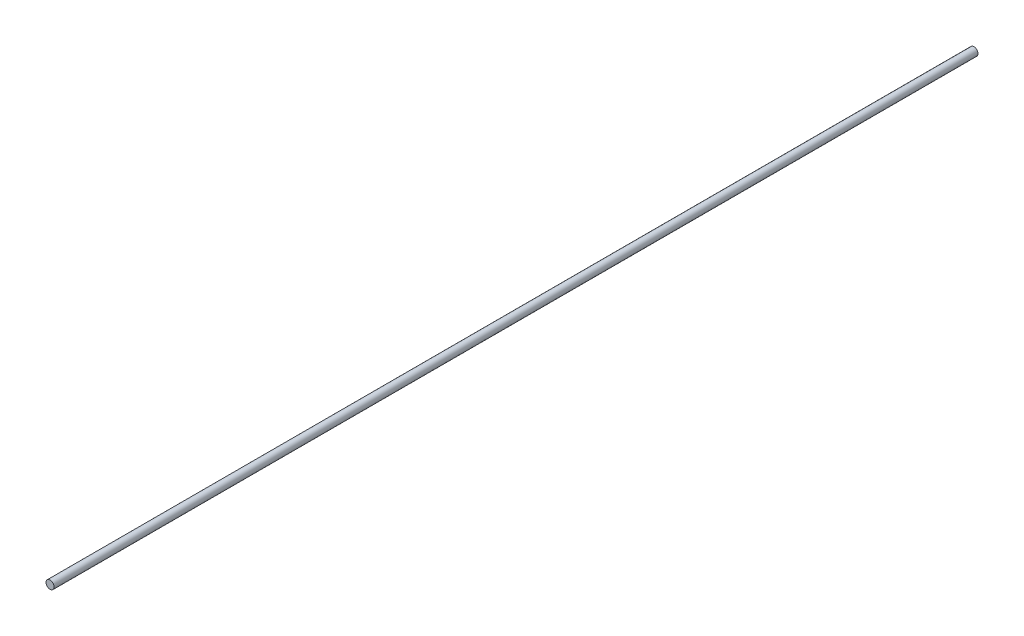
ISO-10303-21;
HEADER;
FILE_DESCRIPTION(('STEP AP214'),'2;1');
FILE_NAME('part.step','',(''),(''),'','','');
FILE_SCHEMA(('AUTOMOTIVE_DESIGN { 1 0 10303 214 1 1 1 1 }'));
ENDSEC;
DATA;
#1=APPLICATION_CONTEXT('core data for automotive mechanical design processes');
#2=APPLICATION_PROTOCOL_DEFINITION('international standard','automotive_design',2000,#1);
#3=PRODUCT_CONTEXT('',#1,'mechanical');
#4=PRODUCT('Part','Part','',(#3));
#5=PRODUCT_RELATED_PRODUCT_CATEGORY('part','',(#4));
#6=PRODUCT_DEFINITION_FORMATION('','',#4);
#7=PRODUCT_DEFINITION_CONTEXT('part definition',#1,'design');
#8=PRODUCT_DEFINITION('design','',#6,#7);
#9=PRODUCT_DEFINITION_SHAPE('','',#8);
#10=(LENGTH_UNIT() NAMED_UNIT(*) SI_UNIT(.MILLI.,.METRE.));
#11=(NAMED_UNIT(*) PLANE_ANGLE_UNIT() SI_UNIT($,.RADIAN.));
#12=(NAMED_UNIT(*) SI_UNIT($,.STERADIAN.) SOLID_ANGLE_UNIT());
#13=UNCERTAINTY_MEASURE_WITH_UNIT(LENGTH_MEASURE(1.E-05),#10,'distance_accuracy_value','');
#14=(GEOMETRIC_REPRESENTATION_CONTEXT(3) GLOBAL_UNCERTAINTY_ASSIGNED_CONTEXT((#13)) GLOBAL_UNIT_ASSIGNED_CONTEXT((#10,
#11,#12)) REPRESENTATION_CONTEXT('',''));
#15=CARTESIAN_POINT('',(0.,0.,0.));
#16=DIRECTION('',(0.,0.,1.));
#17=DIRECTION('',(1.,0.,0.));
#18=AXIS2_PLACEMENT_3D('',#15,#16,#17);
#19=CARTESIAN_POINT('',(0.,0.,457.2));
#20=DIRECTION('',(0.,0.,-1.));
#21=DIRECTION('',(-1.,0.,0.));
#22=AXIS2_PLACEMENT_3D('',#19,#20,#21);
#23=CYLINDRICAL_SURFACE('',#22,4.);
#24=CARTESIAN_POINT('',(0.,0.,457.2));
#25=DIRECTION('',(0.,0.,1.));
#26=DIRECTION('',(1.,0.,0.));
#27=AXIS2_PLACEMENT_3D('',#24,#25,#26);
#28=CIRCLE('',#27,4.);
#29=CARTESIAN_POINT('',(-4.,0.,457.2));
#30=VERTEX_POINT('',#29);
#31=EDGE_CURVE('E10',#30,#30,#28,.T.);
#32=CARTESIAN_POINT('',(0.,0.,-457.2));
#33=DIRECTION('',(0.,0.,1.));
#34=DIRECTION('',(1.,0.,0.));
#35=AXIS2_PLACEMENT_3D('',#32,#33,#34);
#36=CIRCLE('',#35,4.);
#37=CARTESIAN_POINT('',(-4.,0.,-457.2));
#38=VERTEX_POINT('',#37);
#39=EDGE_CURVE('E38',#38,#38,#36,.T.);
#40=CARTESIAN_POINT('',(-4.,0.,457.2));
#41=CARTESIAN_POINT('',(-4.,0.,447.675));
#42=CARTESIAN_POINT('',(-4.,0.,438.15));
#43=CARTESIAN_POINT('',(-4.,0.,419.1));
#44=CARTESIAN_POINT('',(-4.,0.,409.575));
#45=CARTESIAN_POINT('',(-4.,0.,390.525));
#46=CARTESIAN_POINT('',(-4.,0.,381.));
#47=CARTESIAN_POINT('',(-4.,0.,361.95));
#48=CARTESIAN_POINT('',(-4.,0.,352.425));
#49=CARTESIAN_POINT('',(-4.,0.,333.375));
#50=CARTESIAN_POINT('',(-4.,0.,323.85));
#51=CARTESIAN_POINT('',(-4.,0.,304.8));
#52=CARTESIAN_POINT('',(-4.,0.,295.275));
#53=CARTESIAN_POINT('',(-4.,0.,276.225));
#54=CARTESIAN_POINT('',(-4.,0.,266.7));
#55=CARTESIAN_POINT('',(-4.,0.,247.65));
#56=CARTESIAN_POINT('',(-4.,0.,238.125));
#57=CARTESIAN_POINT('',(-4.,0.,219.075));
#58=CARTESIAN_POINT('',(-4.,0.,209.55));
#59=CARTESIAN_POINT('',(-4.,0.,190.5));
#60=CARTESIAN_POINT('',(-4.,0.,180.975));
#61=CARTESIAN_POINT('',(-4.,0.,161.925));
#62=CARTESIAN_POINT('',(-4.,0.,152.4));
#63=CARTESIAN_POINT('',(-4.,0.,133.35));
#64=CARTESIAN_POINT('',(-4.,0.,123.825));
#65=CARTESIAN_POINT('',(-4.,0.,104.775));
#66=CARTESIAN_POINT('',(-4.,0.,95.25));
#67=CARTESIAN_POINT('',(-4.,0.,76.2));
#68=CARTESIAN_POINT('',(-4.,0.,66.675));
#69=CARTESIAN_POINT('',(-4.,0.,47.625));
#70=CARTESIAN_POINT('',(-4.,0.,38.1));
#71=CARTESIAN_POINT('',(-4.,0.,19.05));
#72=CARTESIAN_POINT('',(-4.,0.,9.52499999999995));
#73=CARTESIAN_POINT('',(-4.,0.,-9.52500000000006));
#74=CARTESIAN_POINT('',(-4.,0.,-19.0500000000001));
#75=CARTESIAN_POINT('',(-4.,0.,-38.1000000000001));
#76=CARTESIAN_POINT('',(-4.,0.,-47.625));
#77=CARTESIAN_POINT('',(-4.,0.,-66.675));
#78=CARTESIAN_POINT('',(-4.,0.,-76.2));
#79=CARTESIAN_POINT('',(-4.,0.,-95.2500000000001));
#80=CARTESIAN_POINT('',(-4.,0.,-104.775));
#81=CARTESIAN_POINT('',(-4.,0.,-123.825));
#82=CARTESIAN_POINT('',(-4.,0.,-133.35));
#83=CARTESIAN_POINT('',(-4.,0.,-152.4));
#84=CARTESIAN_POINT('',(-4.,0.,-161.925));
#85=CARTESIAN_POINT('',(-4.,0.,-180.975));
#86=CARTESIAN_POINT('',(-4.,0.,-190.5));
#87=CARTESIAN_POINT('',(-4.,0.,-209.55));
#88=CARTESIAN_POINT('',(-4.,0.,-219.075));
#89=CARTESIAN_POINT('',(-4.,0.,-238.125));
#90=CARTESIAN_POINT('',(-4.,0.,-247.65));
#91=CARTESIAN_POINT('',(-4.,0.,-266.7));
#92=CARTESIAN_POINT('',(-4.,0.,-276.225));
#93=CARTESIAN_POINT('',(-4.,0.,-295.275));
#94=CARTESIAN_POINT('',(-4.,0.,-304.8));
#95=CARTESIAN_POINT('',(-4.,0.,-323.85));
#96=CARTESIAN_POINT('',(-4.,0.,-333.375));
#97=CARTESIAN_POINT('',(-4.,0.,-352.425));
#98=CARTESIAN_POINT('',(-4.,0.,-361.95));
#99=CARTESIAN_POINT('',(-4.,0.,-381.));
#100=CARTESIAN_POINT('',(-4.,0.,-390.525));
#101=CARTESIAN_POINT('',(-4.,0.,-409.575));
#102=CARTESIAN_POINT('',(-4.,0.,-419.1));
#103=CARTESIAN_POINT('',(-4.,0.,-438.15));
#104=CARTESIAN_POINT('',(-4.,0.,-447.675));
#105=CARTESIAN_POINT('',(-4.,0.,-457.2));
#106=B_SPLINE_CURVE_WITH_KNOTS('',3,(#40,#41,#42,#43,#44,#45,#46,#47,#48,#49,#50,#51,#52,#53,
#54,#55,#56,#57,#58,#59,#60,#61,#62,#63,#64,#65,#66,#67,#68,#69,#70,#71,#72,#73,#74,#75,#76,#77,
#78,#79,#80,#81,#82,#83,#84,#85,#86,#87,#88,#89,#90,#91,#92,#93,#94,#95,#96,#97,#98,#99,#100,
#101,#102,#103,#104,#105),.UNSPECIFIED.,.F.,.F.,(4,2,2,2,2,2,2,2,2,2,2,2,2,2,2,2,2,2,2,2,2,2,2,
2,2,2,2,2,2,2,2,2,4),(0.,28.575,57.15,85.7250000000001,114.3,142.875,171.45,200.025,228.6,
257.175,285.75,314.325,342.9,371.475,400.05,428.625,457.2,485.775,514.35,542.925,571.5,600.075,
628.65,657.225,685.8,714.375,742.95,771.525,800.1,828.675,857.25,885.825,914.4),.UNSPECIFIED.);
#107=EDGE_CURVE('BSEAM32',#30,#38,#106,.T.);
#108=ORIENTED_EDGE('',*,*,#31,.F.);
#109=ORIENTED_EDGE('',*,*,#39,.T.);
#110=ORIENTED_EDGE('',*,*,#107,.T.);
#111=ORIENTED_EDGE('',*,*,#107,.F.);
#112=EDGE_LOOP('',(#108,#110,#109,#111));
#113=FACE_BOUND('',#112,.T.);
#114=ADVANCED_FACE('F32',(#113),#23,.T.);
#115=CARTESIAN_POINT('',(0.,0.,457.2));
#116=DIRECTION('',(0.,0.,1.));
#117=DIRECTION('',(1.,0.,0.));
#118=AXIS2_PLACEMENT_3D('',#115,#116,#117);
#119=PLANE('',#118);
#120=ORIENTED_EDGE('',*,*,#31,.T.);
#121=EDGE_LOOP('',(#120));
#122=FACE_BOUND('',#121,.T.);
#123=ADVANCED_FACE('F47',(#122),#119,.T.);
#124=CARTESIAN_POINT('',(0.,0.,-457.2));
#125=DIRECTION('',(0.,0.,1.));
#126=DIRECTION('',(1.,0.,0.));
#127=AXIS2_PLACEMENT_3D('',#124,#125,#126);
#128=PLANE('',#127);
#129=ORIENTED_EDGE('',*,*,#39,.F.);
#130=EDGE_LOOP('',(#129));
#131=FACE_BOUND('',#130,.T.);
#132=ADVANCED_FACE('F45',(#131),#128,.F.);
#133=CLOSED_SHELL('',(#114,#123,#132));
#134=MANIFOLD_SOLID_BREP('B2',#133);
#135=ADVANCED_BREP_SHAPE_REPRESENTATION('',(#18,#134),#14);
#136=SHAPE_DEFINITION_REPRESENTATION(#9,#135);
ENDSEC;
END-ISO-10303-21;
